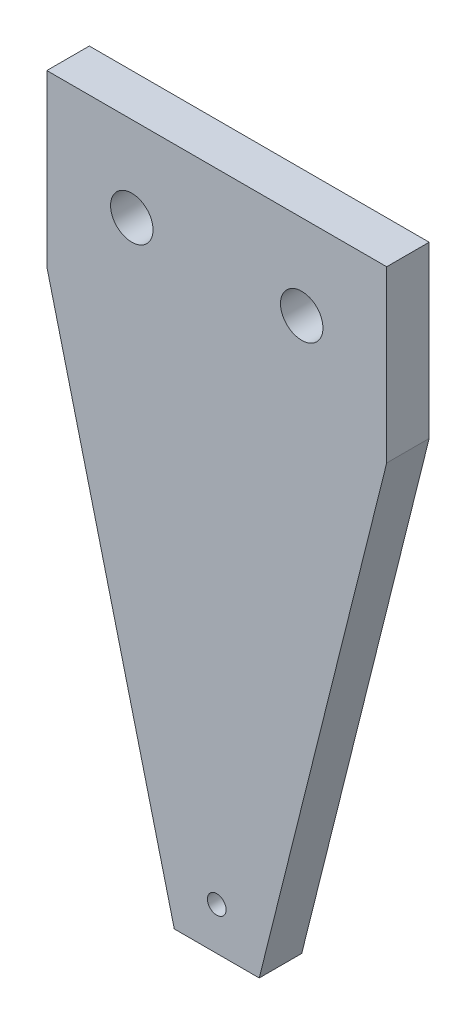
ISO-10303-21;
HEADER;
FILE_DESCRIPTION(('STEP AP214'),'2;1');
FILE_NAME('part.step','',(''),(''),'','','');
FILE_SCHEMA(('AUTOMOTIVE_DESIGN { 1 0 10303 214 1 1 1 1 }'));
ENDSEC;
DATA;
#1=APPLICATION_CONTEXT('core data for automotive mechanical design processes');
#2=APPLICATION_PROTOCOL_DEFINITION('international standard','automotive_design',2000,#1);
#3=PRODUCT_CONTEXT('',#1,'mechanical');
#4=PRODUCT('Part','Part','',(#3));
#5=PRODUCT_RELATED_PRODUCT_CATEGORY('part','',(#4));
#6=PRODUCT_DEFINITION_FORMATION('','',#4);
#7=PRODUCT_DEFINITION_CONTEXT('part definition',#1,'design');
#8=PRODUCT_DEFINITION('design','',#6,#7);
#9=PRODUCT_DEFINITION_SHAPE('','',#8);
#10=(LENGTH_UNIT() NAMED_UNIT(*) SI_UNIT(.MILLI.,.METRE.));
#11=(NAMED_UNIT(*) PLANE_ANGLE_UNIT() SI_UNIT($,.RADIAN.));
#12=(NAMED_UNIT(*) SI_UNIT($,.STERADIAN.) SOLID_ANGLE_UNIT());
#13=UNCERTAINTY_MEASURE_WITH_UNIT(LENGTH_MEASURE(1.E-05),#10,'distance_accuracy_value','');
#14=(GEOMETRIC_REPRESENTATION_CONTEXT(3) GLOBAL_UNCERTAINTY_ASSIGNED_CONTEXT((#13)) GLOBAL_UNIT_ASSIGNED_CONTEXT((#10,
#11,#12)) REPRESENTATION_CONTEXT('',''));
#15=CARTESIAN_POINT('',(0.,0.,0.));
#16=DIRECTION('',(0.,0.,1.));
#17=DIRECTION('',(1.,0.,0.));
#18=AXIS2_PLACEMENT_3D('',#15,#16,#17);
#19=CARTESIAN_POINT('',(0.,0.,5.));
#20=DIRECTION('',(0.,0.,1.));
#21=DIRECTION('',(1.,0.,0.));
#22=AXIS2_PLACEMENT_3D('',#19,#20,#21);
#23=PLANE('',#22);
#24=CARTESIAN_POINT('',(-10.,0.,5.));
#25=DIRECTION('',(0.,0.,1.));
#26=DIRECTION('',(1.,0.,0.));
#27=AXIS2_PLACEMENT_3D('',#24,#25,#26);
#28=CIRCLE('',#27,2.5);
#29=CARTESIAN_POINT('',(-7.5,0.,5.));
#30=VERTEX_POINT('',#29);
#31=EDGE_CURVE('E158',#30,#30,#28,.T.);
#32=ORIENTED_EDGE('',*,*,#31,.F.);
#33=EDGE_LOOP('',(#32));
#34=FACE_BOUND('',#33,.T.);
#35=DIRECTION('',(0.,1.,0.));
#36=VECTOR('',#35,1.);
#37=CARTESIAN_POINT('',(20.,10.,5.));
#38=LINE('',#37,#36);
#39=CARTESIAN_POINT('',(20.,-10.,5.));
#40=VERTEX_POINT('',#39);
#41=CARTESIAN_POINT('',(20.,10.,5.));
#42=VERTEX_POINT('',#41);
#43=EDGE_CURVE('E59',#40,#42,#38,.T.);
#44=ORIENTED_EDGE('',*,*,#43,.T.);
#45=DIRECTION('',(-1.,0.,0.));
#46=VECTOR('',#45,1.);
#47=CARTESIAN_POINT('',(-20.,10.,5.));
#48=LINE('',#47,#46);
#49=CARTESIAN_POINT('',(-20.,10.,5.));
#50=VERTEX_POINT('',#49);
#51=EDGE_CURVE('E82',#42,#50,#48,.T.);
#52=ORIENTED_EDGE('',*,*,#51,.T.);
#53=DIRECTION('',(0.,-1.,0.));
#54=VECTOR('',#53,1.);
#55=CARTESIAN_POINT('',(-20.,10.,5.));
#56=LINE('',#55,#54);
#57=CARTESIAN_POINT('',(-20.,-10.,5.));
#58=VERTEX_POINT('',#57);
#59=EDGE_CURVE('E170',#50,#58,#56,.T.);
#60=ORIENTED_EDGE('',*,*,#59,.T.);
#61=DIRECTION('',(0.242535625036333,-0.970142500145332,0.));
#62=VECTOR('',#61,1.);
#63=CARTESIAN_POINT('',(-21.1764705882353,-5.29411764705882,5.));
#64=LINE('',#63,#62);
#65=CARTESIAN_POINT('',(-5.,-70.,5.));
#66=VERTEX_POINT('',#65);
#67=EDGE_CURVE('E131',#58,#66,#64,.T.);
#68=ORIENTED_EDGE('',*,*,#67,.T.);
#69=DIRECTION('',(1.,0.,0.));
#70=VECTOR('',#69,1.);
#71=CARTESIAN_POINT('',(0.,-70.,5.));
#72=LINE('',#71,#70);
#73=CARTESIAN_POINT('',(5.,-70.,5.));
#74=VERTEX_POINT('',#73);
#75=EDGE_CURVE('E139',#66,#74,#72,.T.);
#76=ORIENTED_EDGE('',*,*,#75,.T.);
#77=DIRECTION('',(0.242535625036333,0.970142500145332,0.));
#78=VECTOR('',#77,1.);
#79=CARTESIAN_POINT('',(21.1764705882353,-5.29411764705882,5.));
#80=LINE('',#79,#78);
#81=EDGE_CURVE('E105',#74,#40,#80,.T.);
#82=ORIENTED_EDGE('',*,*,#81,.T.);
#83=EDGE_LOOP('',(#44,#52,#60,#68,#76,#82));
#84=FACE_BOUND('',#83,.T.);
#85=CARTESIAN_POINT('',(10.,0.,5.));
#86=DIRECTION('',(0.,0.,1.));
#87=DIRECTION('',(-1.,0.,0.));
#88=AXIS2_PLACEMENT_3D('',#85,#86,#87);
#89=CIRCLE('',#88,2.5);
#90=CARTESIAN_POINT('',(7.5,0.,5.));
#91=VERTEX_POINT('',#90);
#92=EDGE_CURVE('E150',#91,#91,#89,.T.);
#93=ORIENTED_EDGE('',*,*,#92,.F.);
#94=EDGE_LOOP('',(#93));
#95=FACE_BOUND('',#94,.T.);
#96=CARTESIAN_POINT('',(0.,-65.,5.));
#97=DIRECTION('',(0.,0.,1.));
#98=DIRECTION('',(1.,0.,0.));
#99=AXIS2_PLACEMENT_3D('',#96,#97,#98);
#100=CIRCLE('',#99,1.1);
#101=CARTESIAN_POINT('',(1.10000000000001,-65.,5.));
#102=VERTEX_POINT('',#101);
#103=EDGE_CURVE('E127',#102,#102,#100,.T.);
#104=ORIENTED_EDGE('',*,*,#103,.F.);
#105=EDGE_LOOP('',(#104));
#106=FACE_BOUND('',#105,.T.);
#107=ADVANCED_FACE('F41',(#34,#84,#95,#106),#23,.T.);
#108=CARTESIAN_POINT('',(0.,0.,0.));
#109=DIRECTION('',(0.,0.,1.));
#110=DIRECTION('',(1.,0.,0.));
#111=AXIS2_PLACEMENT_3D('',#108,#109,#110);
#112=PLANE('',#111);
#113=DIRECTION('',(0.,1.,0.));
#114=VECTOR('',#113,1.);
#115=CARTESIAN_POINT('',(20.,10.,0.));
#116=LINE('',#115,#114);
#117=CARTESIAN_POINT('',(20.,-10.,0.));
#118=VERTEX_POINT('',#117);
#119=CARTESIAN_POINT('',(20.,10.,0.));
#120=VERTEX_POINT('',#119);
#121=EDGE_CURVE('E121',#118,#120,#116,.T.);
#122=ORIENTED_EDGE('',*,*,#121,.F.);
#123=DIRECTION('',(0.242535625036333,0.970142500145332,0.));
#124=VECTOR('',#123,1.);
#125=CARTESIAN_POINT('',(21.1764705882353,-5.29411764705882,0.));
#126=LINE('',#125,#124);
#127=CARTESIAN_POINT('',(5.,-70.,0.));
#128=VERTEX_POINT('',#127);
#129=EDGE_CURVE('E103',#128,#118,#126,.T.);
#130=ORIENTED_EDGE('',*,*,#129,.F.);
#131=DIRECTION('',(1.,0.,0.));
#132=VECTOR('',#131,1.);
#133=CARTESIAN_POINT('',(0.,-70.,0.));
#134=LINE('',#133,#132);
#135=CARTESIAN_POINT('',(-5.,-70.,0.));
#136=VERTEX_POINT('',#135);
#137=EDGE_CURVE('E119',#136,#128,#134,.T.);
#138=ORIENTED_EDGE('',*,*,#137,.F.);
#139=DIRECTION('',(0.242535625036333,-0.970142500145332,0.));
#140=VECTOR('',#139,1.);
#141=CARTESIAN_POINT('',(-21.1764705882353,-5.29411764705882,0.));
#142=LINE('',#141,#140);
#143=CARTESIAN_POINT('',(-20.,-10.,0.));
#144=VERTEX_POINT('',#143);
#145=EDGE_CURVE('E123',#144,#136,#142,.T.);
#146=ORIENTED_EDGE('',*,*,#145,.F.);
#147=DIRECTION('',(0.,-1.,0.));
#148=VECTOR('',#147,1.);
#149=CARTESIAN_POINT('',(-20.,10.,0.));
#150=LINE('',#149,#148);
#151=CARTESIAN_POINT('',(-20.,10.,0.));
#152=VERTEX_POINT('',#151);
#153=EDGE_CURVE('E167',#152,#144,#150,.T.);
#154=ORIENTED_EDGE('',*,*,#153,.F.);
#155=DIRECTION('',(-1.,0.,0.));
#156=VECTOR('',#155,1.);
#157=CARTESIAN_POINT('',(-20.,10.,0.));
#158=LINE('',#157,#156);
#159=EDGE_CURVE('E73',#120,#152,#158,.T.);
#160=ORIENTED_EDGE('',*,*,#159,.F.);
#161=EDGE_LOOP('',(#122,#130,#138,#146,#154,#160));
#162=FACE_BOUND('',#161,.T.);
#163=CARTESIAN_POINT('',(-10.,0.,0.));
#164=DIRECTION('',(0.,0.,1.));
#165=DIRECTION('',(1.,0.,0.));
#166=AXIS2_PLACEMENT_3D('',#163,#164,#165);
#167=CIRCLE('',#166,2.5);
#168=CARTESIAN_POINT('',(-7.5,0.,0.));
#169=VERTEX_POINT('',#168);
#170=EDGE_CURVE('E154',#169,#169,#167,.T.);
#171=ORIENTED_EDGE('',*,*,#170,.T.);
#172=EDGE_LOOP('',(#171));
#173=FACE_BOUND('',#172,.T.);
#174=CARTESIAN_POINT('',(10.,0.,0.));
#175=DIRECTION('',(0.,0.,1.));
#176=DIRECTION('',(-1.,0.,0.));
#177=AXIS2_PLACEMENT_3D('',#174,#175,#176);
#178=CIRCLE('',#177,2.5);
#179=CARTESIAN_POINT('',(7.5,0.,0.));
#180=VERTEX_POINT('',#179);
#181=EDGE_CURVE('E148',#180,#180,#178,.T.);
#182=ORIENTED_EDGE('',*,*,#181,.T.);
#183=EDGE_LOOP('',(#182));
#184=FACE_BOUND('',#183,.T.);
#185=CARTESIAN_POINT('',(0.,-65.,0.));
#186=DIRECTION('',(0.,0.,1.));
#187=DIRECTION('',(1.,0.,0.));
#188=AXIS2_PLACEMENT_3D('',#185,#186,#187);
#189=CIRCLE('',#188,1.1);
#190=CARTESIAN_POINT('',(1.10000000000001,-65.,0.));
#191=VERTEX_POINT('',#190);
#192=EDGE_CURVE('E112',#191,#191,#189,.T.);
#193=ORIENTED_EDGE('',*,*,#192,.T.);
#194=EDGE_LOOP('',(#193));
#195=FACE_BOUND('',#194,.T.);
#196=ADVANCED_FACE('F116',(#162,#173,#184,#195),#112,.F.);
#197=CARTESIAN_POINT('',(20.,10.,5.));
#198=DIRECTION('',(-1.,0.,0.));
#199=DIRECTION('',(0.,0.,1.));
#200=AXIS2_PLACEMENT_3D('',#197,#198,#199);
#201=PLANE('',#200);
#202=ORIENTED_EDGE('',*,*,#121,.T.);
#203=DIRECTION('',(0.,0.,-1.));
#204=VECTOR('',#203,1.);
#205=CARTESIAN_POINT('',(20.,10.,5.));
#206=LINE('',#205,#204);
#207=EDGE_CURVE('E11',#42,#120,#206,.T.);
#208=ORIENTED_EDGE('',*,*,#207,.F.);
#209=ORIENTED_EDGE('',*,*,#43,.F.);
#210=DIRECTION('',(0.,0.,-1.));
#211=VECTOR('',#210,1.);
#212=CARTESIAN_POINT('',(20.,-10.,5.));
#213=LINE('',#212,#211);
#214=EDGE_CURVE('E77',#40,#118,#213,.T.);
#215=ORIENTED_EDGE('',*,*,#214,.T.);
#216=EDGE_LOOP('',(#202,#208,#209,#215));
#217=FACE_BOUND('',#216,.T.);
#218=ADVANCED_FACE('F43',(#217),#201,.F.);
#219=CARTESIAN_POINT('',(-20.,10.,5.));
#220=DIRECTION('',(0.,-1.,0.));
#221=DIRECTION('',(0.,0.,-1.));
#222=AXIS2_PLACEMENT_3D('',#219,#220,#221);
#223=PLANE('',#222);
#224=ORIENTED_EDGE('',*,*,#159,.T.);
#225=DIRECTION('',(0.,0.,-1.));
#226=VECTOR('',#225,1.);
#227=CARTESIAN_POINT('',(-20.,10.,5.));
#228=LINE('',#227,#226);
#229=EDGE_CURVE('E51',#50,#152,#228,.T.);
#230=ORIENTED_EDGE('',*,*,#229,.F.);
#231=ORIENTED_EDGE('',*,*,#51,.F.);
#232=ORIENTED_EDGE('',*,*,#207,.T.);
#233=EDGE_LOOP('',(#224,#230,#231,#232));
#234=FACE_BOUND('',#233,.T.);
#235=ADVANCED_FACE('F195',(#234),#223,.F.);
#236=CARTESIAN_POINT('',(-20.,10.,5.));
#237=DIRECTION('',(1.,0.,0.));
#238=DIRECTION('',(0.,1.,0.));
#239=AXIS2_PLACEMENT_3D('',#236,#237,#238);
#240=PLANE('',#239);
#241=ORIENTED_EDGE('',*,*,#153,.T.);
#242=DIRECTION('',(0.,0.,-1.));
#243=VECTOR('',#242,1.);
#244=CARTESIAN_POINT('',(-20.,-10.,5.));
#245=LINE('',#244,#243);
#246=EDGE_CURVE('E181',#58,#144,#245,.T.);
#247=ORIENTED_EDGE('',*,*,#246,.F.);
#248=ORIENTED_EDGE('',*,*,#59,.F.);
#249=ORIENTED_EDGE('',*,*,#229,.T.);
#250=EDGE_LOOP('',(#241,#247,#248,#249));
#251=FACE_BOUND('',#250,.T.);
#252=ADVANCED_FACE('F188',(#251),#240,.F.);
#253=CARTESIAN_POINT('',(-10.,0.,5.));
#254=DIRECTION('',(0.,0.,-1.));
#255=DIRECTION('',(-1.,0.,0.));
#256=AXIS2_PLACEMENT_3D('',#253,#254,#255);
#257=CYLINDRICAL_SURFACE('',#256,2.5);
#258=ORIENTED_EDGE('',*,*,#31,.T.);
#259=EDGE_LOOP('',(#258));
#260=FACE_BOUND('',#259,.T.);
#261=ORIENTED_EDGE('',*,*,#170,.F.);
#262=EDGE_LOOP('',(#261));
#263=FACE_BOUND('',#262,.T.);
#264=ADVANCED_FACE('F201',(#260,#263),#257,.F.);
#265=CARTESIAN_POINT('',(10.,0.,5.));
#266=DIRECTION('',(0.,0.,-1.));
#267=DIRECTION('',(-1.,0.,0.));
#268=AXIS2_PLACEMENT_3D('',#265,#266,#267);
#269=CYLINDRICAL_SURFACE('',#268,2.5);
#270=ORIENTED_EDGE('',*,*,#92,.T.);
#271=EDGE_LOOP('',(#270));
#272=FACE_BOUND('',#271,.T.);
#273=ORIENTED_EDGE('',*,*,#181,.F.);
#274=EDGE_LOOP('',(#273));
#275=FACE_BOUND('',#274,.T.);
#276=ADVANCED_FACE('F214',(#272,#275),#269,.F.);
#277=CARTESIAN_POINT('',(0.,-70.,0.));
#278=DIRECTION('',(0.,-1.,0.));
#279=DIRECTION('',(0.,0.,-1.));
#280=AXIS2_PLACEMENT_3D('',#277,#278,#279);
#281=PLANE('',#280);
#282=ORIENTED_EDGE('',*,*,#75,.F.);
#283=DIRECTION('',(0.,0.,1.));
#284=VECTOR('',#283,1.);
#285=CARTESIAN_POINT('',(-5.,-70.,0.));
#286=LINE('',#285,#284);
#287=EDGE_CURVE('E111',#136,#66,#286,.T.);
#288=ORIENTED_EDGE('',*,*,#287,.F.);
#289=ORIENTED_EDGE('',*,*,#137,.T.);
#290=DIRECTION('',(0.,0.,1.));
#291=VECTOR('',#290,1.);
#292=CARTESIAN_POINT('',(5.,-70.,0.));
#293=LINE('',#292,#291);
#294=EDGE_CURVE('E100',#128,#74,#293,.T.);
#295=ORIENTED_EDGE('',*,*,#294,.T.);
#296=EDGE_LOOP('',(#282,#288,#289,#295));
#297=FACE_BOUND('',#296,.T.);
#298=ADVANCED_FACE('F125',(#297),#281,.T.);
#299=CARTESIAN_POINT('',(-21.1764705882353,-5.29411764705882,0.));
#300=DIRECTION('',(-0.970142500145332,-0.242535625036333,0.));
#301=DIRECTION('',(0.242535625036333,-0.970142500145332,0.));
#302=AXIS2_PLACEMENT_3D('',#299,#300,#301);
#303=PLANE('',#302);
#304=ORIENTED_EDGE('',*,*,#67,.F.);
#305=ORIENTED_EDGE('',*,*,#246,.T.);
#306=ORIENTED_EDGE('',*,*,#145,.T.);
#307=ORIENTED_EDGE('',*,*,#287,.T.);
#308=EDGE_LOOP('',(#304,#305,#306,#307));
#309=FACE_BOUND('',#308,.T.);
#310=ADVANCED_FACE('F192',(#309),#303,.T.);
#311=CARTESIAN_POINT('',(21.1764705882353,-5.29411764705882,0.));
#312=DIRECTION('',(0.970142500145332,-0.242535625036333,0.));
#313=DIRECTION('',(0.242535625036333,0.970142500145332,0.));
#314=AXIS2_PLACEMENT_3D('',#311,#312,#313);
#315=PLANE('',#314);
#316=ORIENTED_EDGE('',*,*,#81,.F.);
#317=ORIENTED_EDGE('',*,*,#294,.F.);
#318=ORIENTED_EDGE('',*,*,#129,.T.);
#319=ORIENTED_EDGE('',*,*,#214,.F.);
#320=EDGE_LOOP('',(#316,#317,#318,#319));
#321=FACE_BOUND('',#320,.T.);
#322=ADVANCED_FACE('F102',(#321),#315,.T.);
#323=CARTESIAN_POINT('',(0.,-65.,0.));
#324=DIRECTION('',(0.,0.,1.));
#325=DIRECTION('',(1.,0.,0.));
#326=AXIS2_PLACEMENT_3D('',#323,#324,#325);
#327=CYLINDRICAL_SURFACE('',#326,1.1);
#328=ORIENTED_EDGE('',*,*,#192,.F.);
#329=EDGE_LOOP('',(#328));
#330=FACE_BOUND('',#329,.T.);
#331=ORIENTED_EDGE('',*,*,#103,.T.);
#332=EDGE_LOOP('',(#331));
#333=FACE_BOUND('',#332,.T.);
#334=ADVANCED_FACE('F223',(#330,#333),#327,.F.);
#335=CLOSED_SHELL('',(#107,#196,#218,#235,#252,#264,#276,#298,#310,#322,#334));
#336=MANIFOLD_SOLID_BREP('B2',#335);
#337=ADVANCED_BREP_SHAPE_REPRESENTATION('',(#18,#336),#14);
#338=SHAPE_DEFINITION_REPRESENTATION(#9,#337);
ENDSEC;
END-ISO-10303-21;
